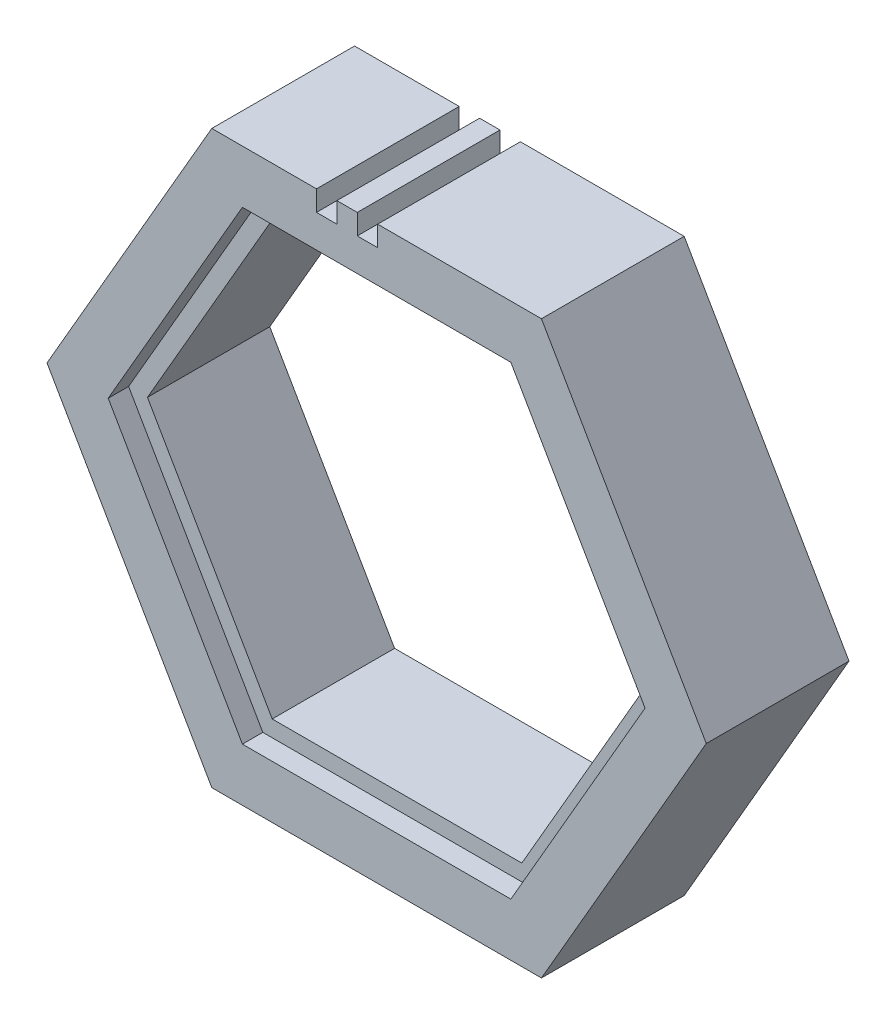
ISO-10303-21;
HEADER;
FILE_DESCRIPTION(('STEP AP214'),'2;1');
FILE_NAME('part.step','',(''),(''),'','','');
FILE_SCHEMA(('AUTOMOTIVE_DESIGN { 1 0 10303 214 1 1 1 1 }'));
ENDSEC;
DATA;
#1=APPLICATION_CONTEXT('core data for automotive mechanical design processes');
#2=APPLICATION_PROTOCOL_DEFINITION('international standard','automotive_design',2000,#1);
#3=PRODUCT_CONTEXT('',#1,'mechanical');
#4=PRODUCT('Part','Part','',(#3));
#5=PRODUCT_RELATED_PRODUCT_CATEGORY('part','',(#4));
#6=PRODUCT_DEFINITION_FORMATION('','',#4);
#7=PRODUCT_DEFINITION_CONTEXT('part definition',#1,'design');
#8=PRODUCT_DEFINITION('design','',#6,#7);
#9=PRODUCT_DEFINITION_SHAPE('','',#8);
#10=(LENGTH_UNIT() NAMED_UNIT(*) SI_UNIT(.MILLI.,.METRE.));
#11=(NAMED_UNIT(*) PLANE_ANGLE_UNIT() SI_UNIT($,.RADIAN.));
#12=(NAMED_UNIT(*) SI_UNIT($,.STERADIAN.) SOLID_ANGLE_UNIT());
#13=UNCERTAINTY_MEASURE_WITH_UNIT(LENGTH_MEASURE(1.E-05),#10,'distance_accuracy_value','');
#14=(GEOMETRIC_REPRESENTATION_CONTEXT(3) GLOBAL_UNCERTAINTY_ASSIGNED_CONTEXT((#13)) GLOBAL_UNIT_ASSIGNED_CONTEXT((#10,
#11,#12)) REPRESENTATION_CONTEXT('',''));
#15=CARTESIAN_POINT('',(0.,0.,0.));
#16=DIRECTION('',(0.,0.,1.));
#17=DIRECTION('',(1.,0.,0.));
#18=AXIS2_PLACEMENT_3D('',#15,#16,#17);
#19=CARTESIAN_POINT('',(4.04145188432738,7.,-2.5));
#20=DIRECTION('',(0.,1.,0.));
#21=DIRECTION('',(0.,0.,1.));
#22=AXIS2_PLACEMENT_3D('',#19,#20,#21);
#23=PLANE('',#22);
#24=DIRECTION('',(0.,0.,1.));
#25=VECTOR('',#24,1.);
#26=CARTESIAN_POINT('',(-1.47477959524167,7.,-2.5));
#27=LINE('',#26,#25);
#28=CARTESIAN_POINT('',(-1.47477959524167,7.,-2.5));
#29=VERTEX_POINT('',#28);
#30=CARTESIAN_POINT('',(-1.47477959524167,7.,1.));
#31=VERTEX_POINT('',#30);
#32=EDGE_CURVE('E251',#29,#31,#27,.T.);
#33=ORIENTED_EDGE('',*,*,#32,.F.);
#34=DIRECTION('',(-1.,0.,0.));
#35=VECTOR('',#34,1.);
#36=CARTESIAN_POINT('',(4.04145188432738,7.,-2.5));
#37=LINE('',#36,#35);
#38=CARTESIAN_POINT('',(-4.04145188432738,7.,-2.5));
#39=VERTEX_POINT('',#38);
#40=EDGE_CURVE('E236',#29,#39,#37,.T.);
#41=ORIENTED_EDGE('',*,*,#40,.T.);
#42=DIRECTION('',(0.,0.,1.));
#43=VECTOR('',#42,1.);
#44=CARTESIAN_POINT('',(-4.04145188432738,7.,-2.5));
#45=LINE('',#44,#43);
#46=CARTESIAN_POINT('',(-4.04145188432738,7.,1.));
#47=VERTEX_POINT('',#46);
#48=EDGE_CURVE('E470',#39,#47,#45,.T.);
#49=ORIENTED_EDGE('',*,*,#48,.T.);
#50=DIRECTION('',(-1.,0.,0.));
#51=VECTOR('',#50,1.);
#52=CARTESIAN_POINT('',(4.04145188432738,7.,1.));
#53=LINE('',#52,#51);
#54=EDGE_CURVE('E404',#31,#47,#53,.T.);
#55=ORIENTED_EDGE('',*,*,#54,.F.);
#56=EDGE_LOOP('',(#33,#41,#49,#55));
#57=FACE_BOUND('',#56,.T.);
#58=ADVANCED_FACE('F39',(#57),#23,.T.);
#59=DIRECTION('',(0.,0.,1.));
#60=VECTOR('',#59,1.);
#61=CARTESIAN_POINT('',(-0.974779595241671,7.,-2.5));
#62=LINE('',#61,#60);
#63=CARTESIAN_POINT('',(-0.974779595241671,7.,-2.5));
#64=VERTEX_POINT('',#63);
#65=CARTESIAN_POINT('',(-0.974779595241671,7.,1.));
#66=VERTEX_POINT('',#65);
#67=EDGE_CURVE('E255',#64,#66,#62,.T.);
#68=ORIENTED_EDGE('',*,*,#67,.T.);
#69=CARTESIAN_POINT('',(-0.474779595241671,7.,1.));
#70=VERTEX_POINT('',#69);
#71=EDGE_CURVE('E410',#70,#66,#53,.T.);
#72=ORIENTED_EDGE('',*,*,#71,.F.);
#73=DIRECTION('',(0.,0.,1.));
#74=VECTOR('',#73,1.);
#75=CARTESIAN_POINT('',(-0.474779595241671,7.,-2.5));
#76=LINE('',#75,#74);
#77=CARTESIAN_POINT('',(-0.474779595241671,7.,-2.5));
#78=VERTEX_POINT('',#77);
#79=EDGE_CURVE('E248',#78,#70,#76,.T.);
#80=ORIENTED_EDGE('',*,*,#79,.F.);
#81=EDGE_CURVE('E453',#78,#64,#37,.T.);
#82=ORIENTED_EDGE('',*,*,#81,.T.);
#83=EDGE_LOOP('',(#68,#72,#80,#82));
#84=FACE_BOUND('',#83,.T.);
#85=ADVANCED_FACE('F510',(#84),#23,.T.);
#86=CARTESIAN_POINT('',(4.04145188432738,-7.,-2.5));
#87=DIRECTION('',(0.866025403784439,-0.5,0.));
#88=DIRECTION('',(0.5,0.866025403784439,0.));
#89=AXIS2_PLACEMENT_3D('',#86,#87,#88);
#90=PLANE('',#89);
#91=DIRECTION('',(0.,0.,1.));
#92=VECTOR('',#91,1.);
#93=CARTESIAN_POINT('',(8.08290376865476,0.,-2.5));
#94=LINE('',#93,#92);
#95=CARTESIAN_POINT('',(8.08290376865476,0.,-2.5));
#96=VERTEX_POINT('',#95);
#97=CARTESIAN_POINT('',(8.08290376865476,0.,1.));
#98=VERTEX_POINT('',#97);
#99=EDGE_CURVE('E43',#96,#98,#94,.T.);
#100=ORIENTED_EDGE('',*,*,#99,.T.);
#101=DIRECTION('',(0.5,0.866025403784439,0.));
#102=VECTOR('',#101,1.);
#103=CARTESIAN_POINT('',(4.04145188432738,-7.,1.));
#104=LINE('',#103,#102);
#105=CARTESIAN_POINT('',(4.04145188432738,-7.,1.));
#106=VERTEX_POINT('',#105);
#107=EDGE_CURVE('E396',#106,#98,#104,.T.);
#108=ORIENTED_EDGE('',*,*,#107,.F.);
#109=DIRECTION('',(0.,0.,1.));
#110=VECTOR('',#109,1.);
#111=CARTESIAN_POINT('',(4.04145188432738,-7.,-2.5));
#112=LINE('',#111,#110);
#113=CARTESIAN_POINT('',(4.04145188432738,-7.,-2.5));
#114=VERTEX_POINT('',#113);
#115=EDGE_CURVE('E11',#114,#106,#112,.T.);
#116=ORIENTED_EDGE('',*,*,#115,.F.);
#117=DIRECTION('',(0.5,0.866025403784439,0.));
#118=VECTOR('',#117,1.);
#119=CARTESIAN_POINT('',(4.04145188432738,-7.,-2.5));
#120=LINE('',#119,#118);
#121=EDGE_CURVE('E426',#114,#96,#120,.T.);
#122=ORIENTED_EDGE('',*,*,#121,.T.);
#123=EDGE_LOOP('',(#100,#108,#116,#122));
#124=FACE_BOUND('',#123,.T.);
#125=ADVANCED_FACE('F41',(#124),#90,.T.);
#126=CARTESIAN_POINT('',(-4.04145188432738,-7.,-2.5));
#127=DIRECTION('',(0.,-1.,0.));
#128=DIRECTION('',(1.,0.,0.));
#129=AXIS2_PLACEMENT_3D('',#126,#127,#128);
#130=PLANE('',#129);
#131=ORIENTED_EDGE('',*,*,#115,.T.);
#132=DIRECTION('',(1.,0.,0.));
#133=VECTOR('',#132,1.);
#134=CARTESIAN_POINT('',(-4.04145188432738,-7.,1.));
#135=LINE('',#134,#133);
#136=CARTESIAN_POINT('',(-4.04145188432738,-7.,1.));
#137=VERTEX_POINT('',#136);
#138=EDGE_CURVE('E418',#137,#106,#135,.T.);
#139=ORIENTED_EDGE('',*,*,#138,.F.);
#140=DIRECTION('',(0.,0.,1.));
#141=VECTOR('',#140,1.);
#142=CARTESIAN_POINT('',(-4.04145188432738,-7.,-2.5));
#143=LINE('',#142,#141);
#144=CARTESIAN_POINT('',(-4.04145188432738,-7.,-2.5));
#145=VERTEX_POINT('',#144);
#146=EDGE_CURVE('E49',#145,#137,#143,.T.);
#147=ORIENTED_EDGE('',*,*,#146,.F.);
#148=DIRECTION('',(1.,0.,0.));
#149=VECTOR('',#148,1.);
#150=CARTESIAN_POINT('',(-4.04145188432738,-7.,-2.5));
#151=LINE('',#150,#149);
#152=EDGE_CURVE('E461',#145,#114,#151,.T.);
#153=ORIENTED_EDGE('',*,*,#152,.T.);
#154=EDGE_LOOP('',(#131,#139,#147,#153));
#155=FACE_BOUND('',#154,.T.);
#156=ADVANCED_FACE('F490',(#155),#130,.T.);
#157=CARTESIAN_POINT('',(-8.08290376865476,0.,-2.5));
#158=DIRECTION('',(-0.866025403784439,-0.5,0.));
#159=DIRECTION('',(0.5,-0.866025403784439,0.));
#160=AXIS2_PLACEMENT_3D('',#157,#158,#159);
#161=PLANE('',#160);
#162=ORIENTED_EDGE('',*,*,#146,.T.);
#163=DIRECTION('',(0.5,-0.866025403784438,0.));
#164=VECTOR('',#163,1.);
#165=CARTESIAN_POINT('',(-8.08290376865476,0.,1.));
#166=LINE('',#165,#164);
#167=CARTESIAN_POINT('',(-8.08290376865476,0.,1.));
#168=VERTEX_POINT('',#167);
#169=EDGE_CURVE('E414',#168,#137,#166,.T.);
#170=ORIENTED_EDGE('',*,*,#169,.F.);
#171=DIRECTION('',(0.,0.,1.));
#172=VECTOR('',#171,1.);
#173=CARTESIAN_POINT('',(-8.08290376865476,0.,-2.5));
#174=LINE('',#173,#172);
#175=CARTESIAN_POINT('',(-8.08290376865476,0.,-2.5));
#176=VERTEX_POINT('',#175);
#177=EDGE_CURVE('E467',#176,#168,#174,.T.);
#178=ORIENTED_EDGE('',*,*,#177,.F.);
#179=DIRECTION('',(0.5,-0.866025403784438,0.));
#180=VECTOR('',#179,1.);
#181=CARTESIAN_POINT('',(-8.08290376865476,0.,-2.5));
#182=LINE('',#181,#180);
#183=EDGE_CURVE('E457',#176,#145,#182,.T.);
#184=ORIENTED_EDGE('',*,*,#183,.T.);
#185=EDGE_LOOP('',(#162,#170,#178,#184));
#186=FACE_BOUND('',#185,.T.);
#187=ADVANCED_FACE('F521',(#186),#161,.T.);
#188=CARTESIAN_POINT('',(-4.04145188432738,7.,-2.5));
#189=DIRECTION('',(-0.866025403784439,0.5,0.));
#190=DIRECTION('',(-0.5,-0.866025403784439,0.));
#191=AXIS2_PLACEMENT_3D('',#188,#189,#190);
#192=PLANE('',#191);
#193=ORIENTED_EDGE('',*,*,#177,.T.);
#194=DIRECTION('',(-0.5,-0.866025403784439,0.));
#195=VECTOR('',#194,1.);
#196=CARTESIAN_POINT('',(-4.04145188432738,7.,1.));
#197=LINE('',#196,#195);
#198=EDGE_CURVE('E409',#47,#168,#197,.T.);
#199=ORIENTED_EDGE('',*,*,#198,.F.);
#200=ORIENTED_EDGE('',*,*,#48,.F.);
#201=DIRECTION('',(-0.5,-0.866025403784439,0.));
#202=VECTOR('',#201,1.);
#203=CARTESIAN_POINT('',(-4.04145188432738,7.,-2.5));
#204=LINE('',#203,#202);
#205=EDGE_CURVE('E452',#39,#176,#204,.T.);
#206=ORIENTED_EDGE('',*,*,#205,.T.);
#207=EDGE_LOOP('',(#193,#199,#200,#206));
#208=FACE_BOUND('',#207,.T.);
#209=ADVANCED_FACE('F519',(#208),#192,.T.);
#210=DIRECTION('',(0.,0.,1.));
#211=VECTOR('',#210,1.);
#212=CARTESIAN_POINT('',(0.025220404758329,7.,-2.5));
#213=LINE('',#212,#211);
#214=CARTESIAN_POINT('',(0.025220404758329,7.,-2.5));
#215=VERTEX_POINT('',#214);
#216=CARTESIAN_POINT('',(0.025220404758329,7.,1.));
#217=VERTEX_POINT('',#216);
#218=EDGE_CURVE('E285',#215,#217,#213,.T.);
#219=ORIENTED_EDGE('',*,*,#218,.T.);
#220=CARTESIAN_POINT('',(4.04145188432738,7.,1.));
#221=VERTEX_POINT('',#220);
#222=EDGE_CURVE('E405',#221,#217,#53,.T.);
#223=ORIENTED_EDGE('',*,*,#222,.F.);
#224=DIRECTION('',(0.,0.,1.));
#225=VECTOR('',#224,1.);
#226=CARTESIAN_POINT('',(4.04145188432738,7.,-2.5));
#227=LINE('',#226,#225);
#228=CARTESIAN_POINT('',(4.04145188432738,7.,-2.5));
#229=VERTEX_POINT('',#228);
#230=EDGE_CURVE('E473',#229,#221,#227,.T.);
#231=ORIENTED_EDGE('',*,*,#230,.F.);
#232=EDGE_CURVE('E448',#229,#215,#37,.T.);
#233=ORIENTED_EDGE('',*,*,#232,.T.);
#234=EDGE_LOOP('',(#219,#223,#231,#233));
#235=FACE_BOUND('',#234,.T.);
#236=ADVANCED_FACE('F496',(#235),#23,.T.);
#237=CARTESIAN_POINT('',(8.08290376865476,0.,-2.5));
#238=DIRECTION('',(0.866025403784439,0.5,0.));
#239=DIRECTION('',(-0.5,0.866025403784439,0.));
#240=AXIS2_PLACEMENT_3D('',#237,#238,#239);
#241=PLANE('',#240);
#242=ORIENTED_EDGE('',*,*,#230,.T.);
#243=DIRECTION('',(-0.5,0.866025403784438,0.));
#244=VECTOR('',#243,1.);
#245=CARTESIAN_POINT('',(8.08290376865476,0.,1.));
#246=LINE('',#245,#244);
#247=EDGE_CURVE('E400',#98,#221,#246,.T.);
#248=ORIENTED_EDGE('',*,*,#247,.F.);
#249=ORIENTED_EDGE('',*,*,#99,.F.);
#250=DIRECTION('',(-0.5,0.866025403784438,0.));
#251=VECTOR('',#250,1.);
#252=CARTESIAN_POINT('',(8.08290376865476,0.,-2.5));
#253=LINE('',#252,#251);
#254=EDGE_CURVE('E444',#96,#229,#253,.T.);
#255=ORIENTED_EDGE('',*,*,#254,.T.);
#256=EDGE_LOOP('',(#242,#248,#249,#255));
#257=FACE_BOUND('',#256,.T.);
#258=ADVANCED_FACE('F482',(#257),#241,.T.);
#259=CARTESIAN_POINT('',(0.,0.,-2.5));
#260=DIRECTION('',(0.,0.,1.));
#261=DIRECTION('',(1.,0.,0.));
#262=AXIS2_PLACEMENT_3D('',#259,#260,#261);
#263=PLANE('',#262);
#264=ORIENTED_EDGE('',*,*,#40,.F.);
#265=DIRECTION('',(0.,-1.,0.));
#266=VECTOR('',#265,1.);
#267=CARTESIAN_POINT('',(-1.47477959524167,7.,-2.5));
#268=LINE('',#267,#266);
#269=CARTESIAN_POINT('',(-1.47477959524167,6.5,-2.5));
#270=VERTEX_POINT('',#269);
#271=EDGE_CURVE('E215',#29,#270,#268,.T.);
#272=ORIENTED_EDGE('',*,*,#271,.T.);
#273=DIRECTION('',(1.,0.,0.));
#274=VECTOR('',#273,1.);
#275=CARTESIAN_POINT('',(-1.47477959524167,6.5,-2.5));
#276=LINE('',#275,#274);
#277=CARTESIAN_POINT('',(-0.974779595241671,6.5,-2.5));
#278=VERTEX_POINT('',#277);
#279=EDGE_CURVE('E225',#270,#278,#276,.T.);
#280=ORIENTED_EDGE('',*,*,#279,.T.);
#281=DIRECTION('',(0.,1.,0.));
#282=VECTOR('',#281,1.);
#283=CARTESIAN_POINT('',(-0.974779595241671,7.,-2.5));
#284=LINE('',#283,#282);
#285=EDGE_CURVE('E222',#278,#64,#284,.T.);
#286=ORIENTED_EDGE('',*,*,#285,.T.);
#287=ORIENTED_EDGE('',*,*,#81,.F.);
#288=DIRECTION('',(0.,-1.,0.));
#289=VECTOR('',#288,1.);
#290=CARTESIAN_POINT('',(-0.474779595241671,7.,-2.5));
#291=LINE('',#290,#289);
#292=CARTESIAN_POINT('',(-0.474779595241671,6.5,-2.5));
#293=VERTEX_POINT('',#292);
#294=EDGE_CURVE('E261',#78,#293,#291,.T.);
#295=ORIENTED_EDGE('',*,*,#294,.T.);
#296=DIRECTION('',(1.,0.,0.));
#297=VECTOR('',#296,1.);
#298=CARTESIAN_POINT('',(-0.474779595241671,6.5,-2.5));
#299=LINE('',#298,#297);
#300=CARTESIAN_POINT('',(0.0252204047583291,6.5,-2.5));
#301=VERTEX_POINT('',#300);
#302=EDGE_CURVE('E265',#293,#301,#299,.T.);
#303=ORIENTED_EDGE('',*,*,#302,.T.);
#304=DIRECTION('',(0.,1.,0.));
#305=VECTOR('',#304,1.);
#306=CARTESIAN_POINT('',(0.025220404758329,7.,-2.5));
#307=LINE('',#306,#305);
#308=EDGE_CURVE('E270',#301,#215,#307,.T.);
#309=ORIENTED_EDGE('',*,*,#308,.T.);
#310=ORIENTED_EDGE('',*,*,#232,.F.);
#311=ORIENTED_EDGE('',*,*,#254,.F.);
#312=ORIENTED_EDGE('',*,*,#121,.F.);
#313=ORIENTED_EDGE('',*,*,#152,.F.);
#314=ORIENTED_EDGE('',*,*,#183,.F.);
#315=ORIENTED_EDGE('',*,*,#205,.F.);
#316=EDGE_LOOP('',(#264,#272,#280,#286,#287,#295,#303,#309,#310,#311,#312,#313,#314,#315));
#317=FACE_BOUND('',#316,.T.);
#318=DIRECTION('',(0.5,-0.866025403784439,0.));
#319=VECTOR('',#318,1.);
#320=CARTESIAN_POINT('',(6.11991285341003,0.,-2.5));
#321=LINE('',#320,#319);
#322=CARTESIAN_POINT('',(3.05995642670502,5.3,-2.5));
#323=VERTEX_POINT('',#322);
#324=CARTESIAN_POINT('',(6.11991285341003,0.,-2.5));
#325=VERTEX_POINT('',#324);
#326=EDGE_CURVE('E254',#323,#325,#321,.T.);
#327=ORIENTED_EDGE('',*,*,#326,.F.);
#328=DIRECTION('',(1.,0.,0.));
#329=VECTOR('',#328,1.);
#330=CARTESIAN_POINT('',(3.05995642670502,5.3,-2.5));
#331=LINE('',#330,#329);
#332=CARTESIAN_POINT('',(-3.05995642670502,5.3,-2.5));
#333=VERTEX_POINT('',#332);
#334=EDGE_CURVE('E294',#333,#323,#331,.T.);
#335=ORIENTED_EDGE('',*,*,#334,.F.);
#336=DIRECTION('',(0.5,0.866025403784439,0.));
#337=VECTOR('',#336,1.);
#338=CARTESIAN_POINT('',(-3.05995642670502,5.3,-2.5));
#339=LINE('',#338,#337);
#340=CARTESIAN_POINT('',(-6.11991285341003,0.,-2.5));
#341=VERTEX_POINT('',#340);
#342=EDGE_CURVE('E299',#341,#333,#339,.T.);
#343=ORIENTED_EDGE('',*,*,#342,.F.);
#344=DIRECTION('',(-0.5,0.866025403784439,0.));
#345=VECTOR('',#344,1.);
#346=CARTESIAN_POINT('',(-6.11991285341003,0.,-2.5));
#347=LINE('',#346,#345);
#348=CARTESIAN_POINT('',(-3.05995642670502,-5.3,-2.5));
#349=VERTEX_POINT('',#348);
#350=EDGE_CURVE('E303',#349,#341,#347,.T.);
#351=ORIENTED_EDGE('',*,*,#350,.F.);
#352=DIRECTION('',(-1.,0.,0.));
#353=VECTOR('',#352,1.);
#354=CARTESIAN_POINT('',(-3.05995642670502,-5.3,-2.5));
#355=LINE('',#354,#353);
#356=CARTESIAN_POINT('',(3.05995642670502,-5.3,-2.5));
#357=VERTEX_POINT('',#356);
#358=EDGE_CURVE('E307',#357,#349,#355,.T.);
#359=ORIENTED_EDGE('',*,*,#358,.F.);
#360=DIRECTION('',(-0.5,-0.866025403784439,0.));
#361=VECTOR('',#360,1.);
#362=CARTESIAN_POINT('',(3.05995642670502,-5.3,-2.5));
#363=LINE('',#362,#361);
#364=EDGE_CURVE('E311',#325,#357,#363,.T.);
#365=ORIENTED_EDGE('',*,*,#364,.F.);
#366=EDGE_LOOP('',(#327,#335,#343,#351,#359,#365));
#367=FACE_BOUND('',#366,.T.);
#368=ADVANCED_FACE('F233',(#317,#367),#263,.F.);
#369=CARTESIAN_POINT('',(3.29089653438087,-5.7,-2.5));
#370=DIRECTION('',(0.866025403784439,-0.5,0.));
#371=DIRECTION('',(0.5,0.866025403784439,0.));
#372=AXIS2_PLACEMENT_3D('',#369,#370,#371);
#373=PLANE('',#372);
#374=DIRECTION('',(0.,0.,1.));
#375=VECTOR('',#374,1.);
#376=CARTESIAN_POINT('',(6.58179306876173,0.,-2.5));
#377=LINE('',#376,#375);
#378=CARTESIAN_POINT('',(6.58179306876173,0.,0.5));
#379=VERTEX_POINT('',#378);
#380=CARTESIAN_POINT('',(6.58179306876173,0.,1.));
#381=VERTEX_POINT('',#380);
#382=EDGE_CURVE('E422',#379,#381,#377,.T.);
#383=ORIENTED_EDGE('',*,*,#382,.F.);
#384=DIRECTION('',(0.5,0.866025403784439,0.));
#385=VECTOR('',#384,1.);
#386=CARTESIAN_POINT('',(3.29089653438087,-5.7,0.5));
#387=LINE('',#386,#385);
#388=CARTESIAN_POINT('',(3.29089653438087,-5.7,0.5));
#389=VERTEX_POINT('',#388);
#390=EDGE_CURVE('E354',#389,#379,#387,.T.);
#391=ORIENTED_EDGE('',*,*,#390,.F.);
#392=DIRECTION('',(0.,0.,1.));
#393=VECTOR('',#392,1.);
#394=CARTESIAN_POINT('',(3.29089653438087,-5.7,-2.5));
#395=LINE('',#394,#393);
#396=CARTESIAN_POINT('',(3.29089653438087,-5.7,1.));
#397=VERTEX_POINT('',#396);
#398=EDGE_CURVE('E423',#389,#397,#395,.T.);
#399=ORIENTED_EDGE('',*,*,#398,.T.);
#400=DIRECTION('',(0.5,0.866025403784439,0.));
#401=VECTOR('',#400,1.);
#402=CARTESIAN_POINT('',(3.29089653438087,-5.7,1.));
#403=LINE('',#402,#401);
#404=EDGE_CURVE('E372',#397,#381,#403,.T.);
#405=ORIENTED_EDGE('',*,*,#404,.T.);
#406=EDGE_LOOP('',(#383,#391,#399,#405));
#407=FACE_BOUND('',#406,.T.);
#408=ADVANCED_FACE('F555',(#407),#373,.F.);
#409=CARTESIAN_POINT('',(-3.29089653438087,-5.7,-2.5));
#410=DIRECTION('',(0.,-1.,0.));
#411=DIRECTION('',(1.,0.,0.));
#412=AXIS2_PLACEMENT_3D('',#409,#410,#411);
#413=PLANE('',#412);
#414=ORIENTED_EDGE('',*,*,#398,.F.);
#415=DIRECTION('',(1.,0.,0.));
#416=VECTOR('',#415,1.);
#417=CARTESIAN_POINT('',(-3.29089653438087,-5.7,0.5));
#418=LINE('',#417,#416);
#419=CARTESIAN_POINT('',(-3.29089653438087,-5.7,0.5));
#420=VERTEX_POINT('',#419);
#421=EDGE_CURVE('E369',#420,#389,#418,.T.);
#422=ORIENTED_EDGE('',*,*,#421,.F.);
#423=DIRECTION('',(0.,0.,1.));
#424=VECTOR('',#423,1.);
#425=CARTESIAN_POINT('',(-3.29089653438087,-5.7,-2.5));
#426=LINE('',#425,#424);
#427=CARTESIAN_POINT('',(-3.29089653438087,-5.7,1.));
#428=VERTEX_POINT('',#427);
#429=EDGE_CURVE('E427',#420,#428,#426,.T.);
#430=ORIENTED_EDGE('',*,*,#429,.T.);
#431=DIRECTION('',(1.,0.,0.));
#432=VECTOR('',#431,1.);
#433=CARTESIAN_POINT('',(-3.29089653438087,-5.7,1.));
#434=LINE('',#433,#432);
#435=EDGE_CURVE('E392',#428,#397,#434,.T.);
#436=ORIENTED_EDGE('',*,*,#435,.T.);
#437=EDGE_LOOP('',(#414,#422,#430,#436));
#438=FACE_BOUND('',#437,.T.);
#439=ADVANCED_FACE('F558',(#438),#413,.F.);
#440=CARTESIAN_POINT('',(-6.58179306876173,0.,-2.5));
#441=DIRECTION('',(-0.866025403784439,-0.5,0.));
#442=DIRECTION('',(0.5,-0.866025403784439,0.));
#443=AXIS2_PLACEMENT_3D('',#440,#441,#442);
#444=PLANE('',#443);
#445=ORIENTED_EDGE('',*,*,#429,.F.);
#446=DIRECTION('',(0.5,-0.866025403784439,0.));
#447=VECTOR('',#446,1.);
#448=CARTESIAN_POINT('',(-6.58179306876174,0.,0.5));
#449=LINE('',#448,#447);
#450=CARTESIAN_POINT('',(-6.58179306876174,0.,0.5));
#451=VERTEX_POINT('',#450);
#452=EDGE_CURVE('E366',#451,#420,#449,.T.);
#453=ORIENTED_EDGE('',*,*,#452,.F.);
#454=DIRECTION('',(0.,0.,1.));
#455=VECTOR('',#454,1.);
#456=CARTESIAN_POINT('',(-6.58179306876173,0.,-2.5));
#457=LINE('',#456,#455);
#458=CARTESIAN_POINT('',(-6.58179306876173,0.,1.));
#459=VERTEX_POINT('',#458);
#460=EDGE_CURVE('E430',#451,#459,#457,.T.);
#461=ORIENTED_EDGE('',*,*,#460,.T.);
#462=DIRECTION('',(0.5,-0.866025403784439,0.));
#463=VECTOR('',#462,1.);
#464=CARTESIAN_POINT('',(-6.58179306876173,0.,1.));
#465=LINE('',#464,#463);
#466=EDGE_CURVE('E388',#459,#428,#465,.T.);
#467=ORIENTED_EDGE('',*,*,#466,.T.);
#468=EDGE_LOOP('',(#445,#453,#461,#467));
#469=FACE_BOUND('',#468,.T.);
#470=ADVANCED_FACE('F571',(#469),#444,.F.);
#471=CARTESIAN_POINT('',(-3.29089653438087,5.7,-2.5));
#472=DIRECTION('',(-0.866025403784439,0.5,0.));
#473=DIRECTION('',(-0.5,-0.866025403784439,0.));
#474=AXIS2_PLACEMENT_3D('',#471,#472,#473);
#475=PLANE('',#474);
#476=ORIENTED_EDGE('',*,*,#460,.F.);
#477=DIRECTION('',(-0.5,-0.866025403784439,0.));
#478=VECTOR('',#477,1.);
#479=CARTESIAN_POINT('',(-3.29089653438087,5.7,0.5));
#480=LINE('',#479,#478);
#481=CARTESIAN_POINT('',(-3.29089653438087,5.7,0.5));
#482=VERTEX_POINT('',#481);
#483=EDGE_CURVE('E363',#482,#451,#480,.T.);
#484=ORIENTED_EDGE('',*,*,#483,.F.);
#485=DIRECTION('',(0.,0.,1.));
#486=VECTOR('',#485,1.);
#487=CARTESIAN_POINT('',(-3.29089653438087,5.7,-2.5));
#488=LINE('',#487,#486);
#489=CARTESIAN_POINT('',(-3.29089653438087,5.7,1.));
#490=VERTEX_POINT('',#489);
#491=EDGE_CURVE('E433',#482,#490,#488,.T.);
#492=ORIENTED_EDGE('',*,*,#491,.T.);
#493=DIRECTION('',(-0.5,-0.866025403784439,0.));
#494=VECTOR('',#493,1.);
#495=CARTESIAN_POINT('',(-3.29089653438087,5.7,1.));
#496=LINE('',#495,#494);
#497=EDGE_CURVE('E384',#490,#459,#496,.T.);
#498=ORIENTED_EDGE('',*,*,#497,.T.);
#499=EDGE_LOOP('',(#476,#484,#492,#498));
#500=FACE_BOUND('',#499,.T.);
#501=ADVANCED_FACE('F567',(#500),#475,.F.);
#502=CARTESIAN_POINT('',(3.29089653438086,5.7,-2.5));
#503=DIRECTION('',(0.,1.,0.));
#504=DIRECTION('',(0.,0.,1.));
#505=AXIS2_PLACEMENT_3D('',#502,#503,#504);
#506=PLANE('',#505);
#507=ORIENTED_EDGE('',*,*,#491,.F.);
#508=DIRECTION('',(-1.,0.,0.));
#509=VECTOR('',#508,1.);
#510=CARTESIAN_POINT('',(3.29089653438086,5.7,0.5));
#511=LINE('',#510,#509);
#512=CARTESIAN_POINT('',(3.29089653438086,5.7,0.5));
#513=VERTEX_POINT('',#512);
#514=EDGE_CURVE('E360',#513,#482,#511,.T.);
#515=ORIENTED_EDGE('',*,*,#514,.F.);
#516=DIRECTION('',(0.,0.,1.));
#517=VECTOR('',#516,1.);
#518=CARTESIAN_POINT('',(3.29089653438086,5.7,-2.5));
#519=LINE('',#518,#517);
#520=CARTESIAN_POINT('',(3.29089653438086,5.7,1.));
#521=VERTEX_POINT('',#520);
#522=EDGE_CURVE('E436',#513,#521,#519,.T.);
#523=ORIENTED_EDGE('',*,*,#522,.T.);
#524=DIRECTION('',(-1.,0.,0.));
#525=VECTOR('',#524,1.);
#526=CARTESIAN_POINT('',(3.29089653438086,5.7,1.));
#527=LINE('',#526,#525);
#528=EDGE_CURVE('E380',#521,#490,#527,.T.);
#529=ORIENTED_EDGE('',*,*,#528,.T.);
#530=EDGE_LOOP('',(#507,#515,#523,#529));
#531=FACE_BOUND('',#530,.T.);
#532=ADVANCED_FACE('F563',(#531),#506,.F.);
#533=CARTESIAN_POINT('',(6.58179306876173,0.,-2.5));
#534=DIRECTION('',(0.866025403784439,0.5,0.));
#535=DIRECTION('',(-0.5,0.866025403784439,0.));
#536=AXIS2_PLACEMENT_3D('',#533,#534,#535);
#537=PLANE('',#536);
#538=ORIENTED_EDGE('',*,*,#522,.F.);
#539=DIRECTION('',(-0.5,0.866025403784438,0.));
#540=VECTOR('',#539,1.);
#541=CARTESIAN_POINT('',(6.58179306876173,0.,0.5));
#542=LINE('',#541,#540);
#543=EDGE_CURVE('E357',#379,#513,#542,.T.);
#544=ORIENTED_EDGE('',*,*,#543,.F.);
#545=ORIENTED_EDGE('',*,*,#382,.T.);
#546=DIRECTION('',(-0.5,0.866025403784439,0.));
#547=VECTOR('',#546,1.);
#548=CARTESIAN_POINT('',(6.58179306876173,0.,1.));
#549=LINE('',#548,#547);
#550=EDGE_CURVE('E376',#381,#521,#549,.T.);
#551=ORIENTED_EDGE('',*,*,#550,.T.);
#552=EDGE_LOOP('',(#538,#544,#545,#551));
#553=FACE_BOUND('',#552,.T.);
#554=ADVANCED_FACE('F560',(#553),#537,.F.);
#555=CARTESIAN_POINT('',(0.,0.,1.));
#556=DIRECTION('',(0.,0.,1.));
#557=DIRECTION('',(1.,0.,0.));
#558=AXIS2_PLACEMENT_3D('',#555,#556,#557);
#559=PLANE('',#558);
#560=DIRECTION('',(0.,-1.,0.));
#561=VECTOR('',#560,1.);
#562=CARTESIAN_POINT('',(-1.47477959524167,7.,1.));
#563=LINE('',#562,#561);
#564=CARTESIAN_POINT('',(-1.47477959524167,6.5,1.));
#565=VERTEX_POINT('',#564);
#566=EDGE_CURVE('E57',#31,#565,#563,.T.);
#567=ORIENTED_EDGE('',*,*,#566,.F.);
#568=ORIENTED_EDGE('',*,*,#54,.T.);
#569=ORIENTED_EDGE('',*,*,#198,.T.);
#570=ORIENTED_EDGE('',*,*,#169,.T.);
#571=ORIENTED_EDGE('',*,*,#138,.T.);
#572=ORIENTED_EDGE('',*,*,#107,.T.);
#573=ORIENTED_EDGE('',*,*,#247,.T.);
#574=ORIENTED_EDGE('',*,*,#222,.T.);
#575=DIRECTION('',(0.,1.,0.));
#576=VECTOR('',#575,1.);
#577=CARTESIAN_POINT('',(0.025220404758329,7.,1.));
#578=LINE('',#577,#576);
#579=CARTESIAN_POINT('',(0.0252204047583291,6.5,1.));
#580=VERTEX_POINT('',#579);
#581=EDGE_CURVE('E266',#580,#217,#578,.T.);
#582=ORIENTED_EDGE('',*,*,#581,.F.);
#583=DIRECTION('',(1.,0.,0.));
#584=VECTOR('',#583,1.);
#585=CARTESIAN_POINT('',(-0.474779595241671,6.5,1.));
#586=LINE('',#585,#584);
#587=CARTESIAN_POINT('',(-0.474779595241671,6.5,1.));
#588=VERTEX_POINT('',#587);
#589=EDGE_CURVE('E277',#588,#580,#586,.T.);
#590=ORIENTED_EDGE('',*,*,#589,.F.);
#591=DIRECTION('',(0.,-1.,0.));
#592=VECTOR('',#591,1.);
#593=CARTESIAN_POINT('',(-0.474779595241671,7.,1.));
#594=LINE('',#593,#592);
#595=EDGE_CURVE('E65',#70,#588,#594,.T.);
#596=ORIENTED_EDGE('',*,*,#595,.F.);
#597=ORIENTED_EDGE('',*,*,#71,.T.);
#598=DIRECTION('',(0.,1.,0.));
#599=VECTOR('',#598,1.);
#600=CARTESIAN_POINT('',(-0.974779595241671,7.,1.));
#601=LINE('',#600,#599);
#602=CARTESIAN_POINT('',(-0.974779595241671,6.5,1.));
#603=VERTEX_POINT('',#602);
#604=EDGE_CURVE('E238',#603,#66,#601,.T.);
#605=ORIENTED_EDGE('',*,*,#604,.F.);
#606=DIRECTION('',(1.,0.,0.));
#607=VECTOR('',#606,1.);
#608=CARTESIAN_POINT('',(-1.47477959524167,6.5,1.));
#609=LINE('',#608,#607);
#610=EDGE_CURVE('E241',#565,#603,#609,.T.);
#611=ORIENTED_EDGE('',*,*,#610,.F.);
#612=EDGE_LOOP('',(#567,#568,#569,#570,#571,#572,#573,#574,#582,#590,#596,#597,#605,#611));
#613=FACE_BOUND('',#612,.T.);
#614=ORIENTED_EDGE('',*,*,#550,.F.);
#615=ORIENTED_EDGE('',*,*,#404,.F.);
#616=ORIENTED_EDGE('',*,*,#435,.F.);
#617=ORIENTED_EDGE('',*,*,#466,.F.);
#618=ORIENTED_EDGE('',*,*,#497,.F.);
#619=ORIENTED_EDGE('',*,*,#528,.F.);
#620=EDGE_LOOP('',(#614,#615,#616,#617,#618,#619));
#621=FACE_BOUND('',#620,.T.);
#622=ADVANCED_FACE('F485',(#613,#621),#559,.T.);
#623=CARTESIAN_POINT('',(0.,0.,0.5));
#624=DIRECTION('',(0.,0.,1.));
#625=DIRECTION('',(1.,0.,0.));
#626=AXIS2_PLACEMENT_3D('',#623,#624,#625);
#627=PLANE('',#626);
#628=ORIENTED_EDGE('',*,*,#390,.T.);
#629=ORIENTED_EDGE('',*,*,#543,.T.);
#630=ORIENTED_EDGE('',*,*,#514,.T.);
#631=ORIENTED_EDGE('',*,*,#483,.T.);
#632=ORIENTED_EDGE('',*,*,#452,.T.);
#633=ORIENTED_EDGE('',*,*,#421,.T.);
#634=EDGE_LOOP('',(#628,#629,#630,#631,#632,#633));
#635=FACE_BOUND('',#634,.T.);
#636=DIRECTION('',(-0.5,0.866025403784439,0.));
#637=VECTOR('',#636,1.);
#638=CARTESIAN_POINT('',(6.11991285341003,0.,0.5));
#639=LINE('',#638,#637);
#640=CARTESIAN_POINT('',(6.11991285341003,0.,0.5));
#641=VERTEX_POINT('',#640);
#642=CARTESIAN_POINT('',(3.05995642670502,5.3,0.5));
#643=VERTEX_POINT('',#642);
#644=EDGE_CURVE('E320',#641,#643,#639,.T.);
#645=ORIENTED_EDGE('',*,*,#644,.F.);
#646=DIRECTION('',(0.5,0.866025403784439,0.));
#647=VECTOR('',#646,1.);
#648=CARTESIAN_POINT('',(3.05995642670502,-5.3,0.5));
#649=LINE('',#648,#647);
#650=CARTESIAN_POINT('',(3.05995642670502,-5.3,0.5));
#651=VERTEX_POINT('',#650);
#652=EDGE_CURVE('E298',#651,#641,#649,.T.);
#653=ORIENTED_EDGE('',*,*,#652,.F.);
#654=DIRECTION('',(1.,0.,0.));
#655=VECTOR('',#654,1.);
#656=CARTESIAN_POINT('',(-3.05995642670502,-5.3,0.5));
#657=LINE('',#656,#655);
#658=CARTESIAN_POINT('',(-3.05995642670502,-5.3,0.5));
#659=VERTEX_POINT('',#658);
#660=EDGE_CURVE('E333',#659,#651,#657,.T.);
#661=ORIENTED_EDGE('',*,*,#660,.F.);
#662=DIRECTION('',(0.5,-0.866025403784439,0.));
#663=VECTOR('',#662,1.);
#664=CARTESIAN_POINT('',(-6.11991285341003,0.,0.5));
#665=LINE('',#664,#663);
#666=CARTESIAN_POINT('',(-6.11991285341003,0.,0.5));
#667=VERTEX_POINT('',#666);
#668=EDGE_CURVE('E329',#667,#659,#665,.T.);
#669=ORIENTED_EDGE('',*,*,#668,.F.);
#670=DIRECTION('',(-0.5,-0.866025403784439,0.));
#671=VECTOR('',#670,1.);
#672=CARTESIAN_POINT('',(-3.05995642670502,5.3,0.5));
#673=LINE('',#672,#671);
#674=CARTESIAN_POINT('',(-3.05995642670502,5.3,0.5));
#675=VERTEX_POINT('',#674);
#676=EDGE_CURVE('E326',#675,#667,#673,.T.);
#677=ORIENTED_EDGE('',*,*,#676,.F.);
#678=DIRECTION('',(-1.,0.,0.));
#679=VECTOR('',#678,1.);
#680=CARTESIAN_POINT('',(3.05995642670502,5.3,0.5));
#681=LINE('',#680,#679);
#682=EDGE_CURVE('E323',#643,#675,#681,.T.);
#683=ORIENTED_EDGE('',*,*,#682,.F.);
#684=EDGE_LOOP('',(#645,#653,#661,#669,#677,#683));
#685=FACE_BOUND('',#684,.T.);
#686=ADVANCED_FACE('F581',(#635,#685),#627,.T.);
#687=CARTESIAN_POINT('',(3.05995642670502,-5.3,0.5));
#688=DIRECTION('',(-0.866025403784439,0.5,0.));
#689=DIRECTION('',(-0.5,-0.866025403784439,0.));
#690=AXIS2_PLACEMENT_3D('',#687,#688,#689);
#691=PLANE('',#690);
#692=DIRECTION('',(0.,0.,-1.));
#693=VECTOR('',#692,1.);
#694=CARTESIAN_POINT('',(6.11991285341003,0.,0.5));
#695=LINE('',#694,#693);
#696=EDGE_CURVE('E351',#641,#325,#695,.T.);
#697=ORIENTED_EDGE('',*,*,#696,.T.);
#698=ORIENTED_EDGE('',*,*,#364,.T.);
#699=DIRECTION('',(0.,0.,-1.));
#700=VECTOR('',#699,1.);
#701=CARTESIAN_POINT('',(3.05995642670502,-5.3,0.5));
#702=LINE('',#701,#700);
#703=EDGE_CURVE('E336',#651,#357,#702,.T.);
#704=ORIENTED_EDGE('',*,*,#703,.F.);
#705=ORIENTED_EDGE('',*,*,#652,.T.);
#706=EDGE_LOOP('',(#697,#698,#704,#705));
#707=FACE_BOUND('',#706,.T.);
#708=ADVANCED_FACE('F584',(#707),#691,.T.);
#709=CARTESIAN_POINT('',(6.11991285341003,0.,0.5));
#710=DIRECTION('',(-0.866025403784439,-0.5,0.));
#711=DIRECTION('',(0.5,-0.866025403784439,0.));
#712=AXIS2_PLACEMENT_3D('',#709,#710,#711);
#713=PLANE('',#712);
#714=DIRECTION('',(0.,0.,-1.));
#715=VECTOR('',#714,1.);
#716=CARTESIAN_POINT('',(3.05995642670502,5.3,0.5));
#717=LINE('',#716,#715);
#718=EDGE_CURVE('E348',#643,#323,#717,.T.);
#719=ORIENTED_EDGE('',*,*,#718,.T.);
#720=ORIENTED_EDGE('',*,*,#326,.T.);
#721=ORIENTED_EDGE('',*,*,#696,.F.);
#722=ORIENTED_EDGE('',*,*,#644,.T.);
#723=EDGE_LOOP('',(#719,#720,#721,#722));
#724=FACE_BOUND('',#723,.T.);
#725=ADVANCED_FACE('F588',(#724),#713,.T.);
#726=CARTESIAN_POINT('',(3.05995642670502,5.3,0.5));
#727=DIRECTION('',(0.,-1.,0.));
#728=DIRECTION('',(0.,0.,-1.));
#729=AXIS2_PLACEMENT_3D('',#726,#727,#728);
#730=PLANE('',#729);
#731=DIRECTION('',(0.,0.,-1.));
#732=VECTOR('',#731,1.);
#733=CARTESIAN_POINT('',(-3.05995642670502,5.3,0.5));
#734=LINE('',#733,#732);
#735=EDGE_CURVE('E345',#675,#333,#734,.T.);
#736=ORIENTED_EDGE('',*,*,#735,.T.);
#737=ORIENTED_EDGE('',*,*,#334,.T.);
#738=ORIENTED_EDGE('',*,*,#718,.F.);
#739=ORIENTED_EDGE('',*,*,#682,.T.);
#740=EDGE_LOOP('',(#736,#737,#738,#739));
#741=FACE_BOUND('',#740,.T.);
#742=ADVANCED_FACE('F592',(#741),#730,.T.);
#743=CARTESIAN_POINT('',(-3.05995642670502,5.3,0.5));
#744=DIRECTION('',(0.866025403784439,-0.5,0.));
#745=DIRECTION('',(0.5,0.866025403784439,0.));
#746=AXIS2_PLACEMENT_3D('',#743,#744,#745);
#747=PLANE('',#746);
#748=DIRECTION('',(0.,0.,-1.));
#749=VECTOR('',#748,1.);
#750=CARTESIAN_POINT('',(-6.11991285341003,0.,0.5));
#751=LINE('',#750,#749);
#752=EDGE_CURVE('E342',#667,#341,#751,.T.);
#753=ORIENTED_EDGE('',*,*,#752,.T.);
#754=ORIENTED_EDGE('',*,*,#342,.T.);
#755=ORIENTED_EDGE('',*,*,#735,.F.);
#756=ORIENTED_EDGE('',*,*,#676,.T.);
#757=EDGE_LOOP('',(#753,#754,#755,#756));
#758=FACE_BOUND('',#757,.T.);
#759=ADVANCED_FACE('F596',(#758),#747,.T.);
#760=CARTESIAN_POINT('',(-6.11991285341003,0.,0.5));
#761=DIRECTION('',(0.866025403784439,0.5,0.));
#762=DIRECTION('',(-0.5,0.866025403784439,0.));
#763=AXIS2_PLACEMENT_3D('',#760,#761,#762);
#764=PLANE('',#763);
#765=DIRECTION('',(0.,0.,-1.));
#766=VECTOR('',#765,1.);
#767=CARTESIAN_POINT('',(-3.05995642670502,-5.3,0.5));
#768=LINE('',#767,#766);
#769=EDGE_CURVE('E339',#659,#349,#768,.T.);
#770=ORIENTED_EDGE('',*,*,#769,.T.);
#771=ORIENTED_EDGE('',*,*,#350,.T.);
#772=ORIENTED_EDGE('',*,*,#752,.F.);
#773=ORIENTED_EDGE('',*,*,#668,.T.);
#774=EDGE_LOOP('',(#770,#771,#772,#773));
#775=FACE_BOUND('',#774,.T.);
#776=ADVANCED_FACE('F600',(#775),#764,.T.);
#777=CARTESIAN_POINT('',(-3.05995642670502,-5.3,0.5));
#778=DIRECTION('',(0.,1.,0.));
#779=DIRECTION('',(-1.,0.,0.));
#780=AXIS2_PLACEMENT_3D('',#777,#778,#779);
#781=PLANE('',#780);
#782=ORIENTED_EDGE('',*,*,#703,.T.);
#783=ORIENTED_EDGE('',*,*,#358,.T.);
#784=ORIENTED_EDGE('',*,*,#769,.F.);
#785=ORIENTED_EDGE('',*,*,#660,.T.);
#786=EDGE_LOOP('',(#782,#783,#784,#785));
#787=FACE_BOUND('',#786,.T.);
#788=ADVANCED_FACE('F604',(#787),#781,.T.);
#789=CARTESIAN_POINT('',(-0.474779595241671,7.,-2.5));
#790=DIRECTION('',(-1.,0.,0.));
#791=DIRECTION('',(0.,0.,1.));
#792=AXIS2_PLACEMENT_3D('',#789,#790,#791);
#793=PLANE('',#792);
#794=ORIENTED_EDGE('',*,*,#595,.T.);
#795=DIRECTION('',(0.,0.,1.));
#796=VECTOR('',#795,1.);
#797=CARTESIAN_POINT('',(-0.474779595241671,6.5,-2.5));
#798=LINE('',#797,#796);
#799=EDGE_CURVE('E274',#293,#588,#798,.T.);
#800=ORIENTED_EDGE('',*,*,#799,.F.);
#801=ORIENTED_EDGE('',*,*,#294,.F.);
#802=ORIENTED_EDGE('',*,*,#79,.T.);
#803=EDGE_LOOP('',(#794,#800,#801,#802));
#804=FACE_BOUND('',#803,.T.);
#805=ADVANCED_FACE('F504',(#804),#793,.F.);
#806=CARTESIAN_POINT('',(0.025220404758329,7.,-2.5));
#807=DIRECTION('',(1.,0.,0.));
#808=DIRECTION('',(0.,1.,0.));
#809=AXIS2_PLACEMENT_3D('',#806,#807,#808);
#810=PLANE('',#809);
#811=ORIENTED_EDGE('',*,*,#581,.T.);
#812=ORIENTED_EDGE('',*,*,#218,.F.);
#813=ORIENTED_EDGE('',*,*,#308,.F.);
#814=DIRECTION('',(0.,0.,1.));
#815=VECTOR('',#814,1.);
#816=CARTESIAN_POINT('',(0.0252204047583291,6.5,-2.5));
#817=LINE('',#816,#815);
#818=EDGE_CURVE('E289',#301,#580,#817,.T.);
#819=ORIENTED_EDGE('',*,*,#818,.T.);
#820=EDGE_LOOP('',(#811,#812,#813,#819));
#821=FACE_BOUND('',#820,.T.);
#822=ADVANCED_FACE('F500',(#821),#810,.F.);
#823=CARTESIAN_POINT('',(-0.474779595241671,6.5,-2.5));
#824=DIRECTION('',(0.,-1.,0.));
#825=DIRECTION('',(0.,0.,-1.));
#826=AXIS2_PLACEMENT_3D('',#823,#824,#825);
#827=PLANE('',#826);
#828=ORIENTED_EDGE('',*,*,#589,.T.);
#829=ORIENTED_EDGE('',*,*,#818,.F.);
#830=ORIENTED_EDGE('',*,*,#302,.F.);
#831=ORIENTED_EDGE('',*,*,#799,.T.);
#832=EDGE_LOOP('',(#828,#829,#830,#831));
#833=FACE_BOUND('',#832,.T.);
#834=ADVANCED_FACE('F503',(#833),#827,.F.);
#835=CARTESIAN_POINT('',(-1.47477959524167,7.,-2.5));
#836=DIRECTION('',(-1.,0.,0.));
#837=DIRECTION('',(0.,0.,1.));
#838=AXIS2_PLACEMENT_3D('',#835,#836,#837);
#839=PLANE('',#838);
#840=ORIENTED_EDGE('',*,*,#566,.T.);
#841=DIRECTION('',(0.,0.,1.));
#842=VECTOR('',#841,1.);
#843=CARTESIAN_POINT('',(-1.47477959524167,6.5,-2.5));
#844=LINE('',#843,#842);
#845=EDGE_CURVE('E211',#270,#565,#844,.T.);
#846=ORIENTED_EDGE('',*,*,#845,.F.);
#847=ORIENTED_EDGE('',*,*,#271,.F.);
#848=ORIENTED_EDGE('',*,*,#32,.T.);
#849=EDGE_LOOP('',(#840,#846,#847,#848));
#850=FACE_BOUND('',#849,.T.);
#851=ADVANCED_FACE('F213',(#850),#839,.F.);
#852=CARTESIAN_POINT('',(-0.974779595241671,7.,-2.5));
#853=DIRECTION('',(1.,0.,0.));
#854=DIRECTION('',(0.,1.,0.));
#855=AXIS2_PLACEMENT_3D('',#852,#853,#854);
#856=PLANE('',#855);
#857=ORIENTED_EDGE('',*,*,#604,.T.);
#858=ORIENTED_EDGE('',*,*,#67,.F.);
#859=ORIENTED_EDGE('',*,*,#285,.F.);
#860=DIRECTION('',(0.,0.,1.));
#861=VECTOR('',#860,1.);
#862=CARTESIAN_POINT('',(-0.974779595241671,6.5,-2.5));
#863=LINE('',#862,#861);
#864=EDGE_CURVE('E221',#278,#603,#863,.T.);
#865=ORIENTED_EDGE('',*,*,#864,.T.);
#866=EDGE_LOOP('',(#857,#858,#859,#865));
#867=FACE_BOUND('',#866,.T.);
#868=ADVANCED_FACE('F526',(#867),#856,.F.);
#869=CARTESIAN_POINT('',(-1.47477959524167,6.5,-2.5));
#870=DIRECTION('',(0.,-1.,0.));
#871=DIRECTION('',(0.,0.,-1.));
#872=AXIS2_PLACEMENT_3D('',#869,#870,#871);
#873=PLANE('',#872);
#874=ORIENTED_EDGE('',*,*,#610,.T.);
#875=ORIENTED_EDGE('',*,*,#864,.F.);
#876=ORIENTED_EDGE('',*,*,#279,.F.);
#877=ORIENTED_EDGE('',*,*,#845,.T.);
#878=EDGE_LOOP('',(#874,#875,#876,#877));
#879=FACE_BOUND('',#878,.T.);
#880=ADVANCED_FACE('F226',(#879),#873,.F.);
#881=CLOSED_SHELL('',(#58,#85,#125,#156,#187,#209,#236,#258,#368,#408,#439,#470,#501,#532,#554,
#622,#686,#708,#725,#742,#759,#776,#788,#805,#822,#834,#851,#868,#880));
#882=MANIFOLD_SOLID_BREP('B2',#881);
#883=ADVANCED_BREP_SHAPE_REPRESENTATION('',(#18,#882),#14);
#884=SHAPE_DEFINITION_REPRESENTATION(#9,#883);
ENDSEC;
END-ISO-10303-21;
